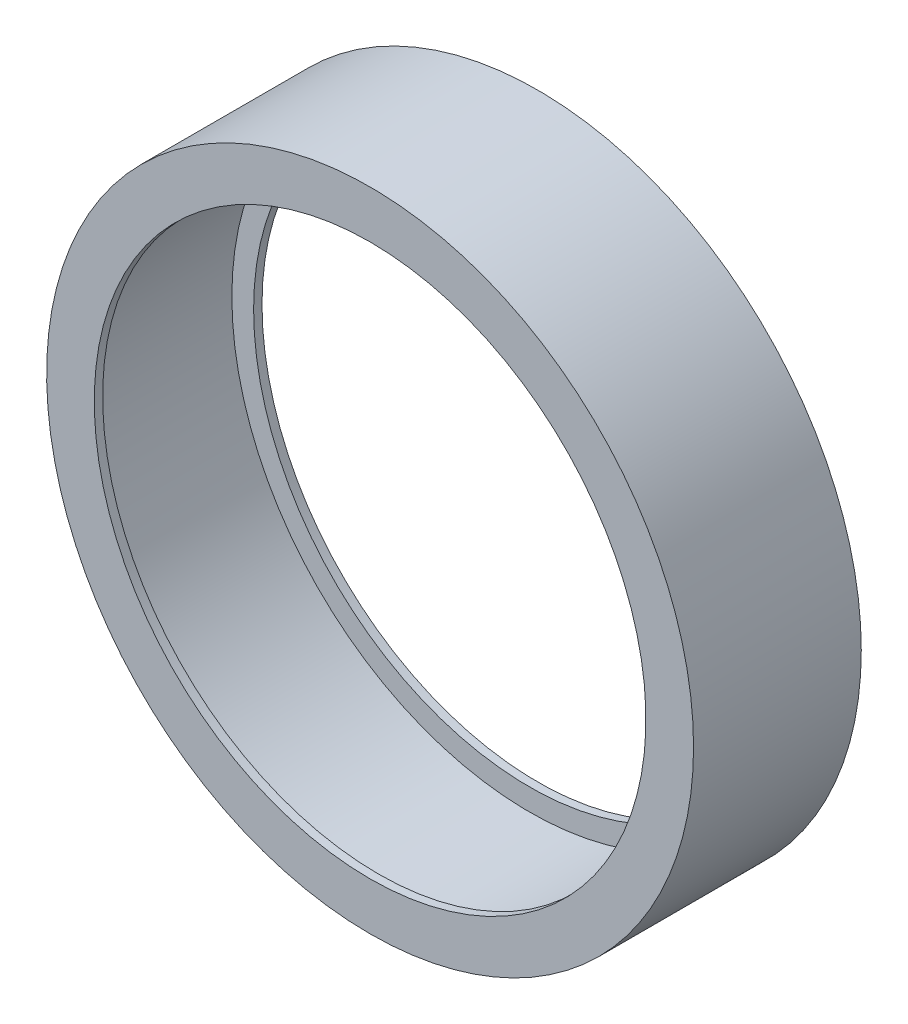
ISO-10303-21;
HEADER;
FILE_DESCRIPTION(('STEP AP214'),'2;1');
FILE_NAME('part.step','',(''),(''),'','','');
FILE_SCHEMA(('AUTOMOTIVE_DESIGN { 1 0 10303 214 1 1 1 1 }'));
ENDSEC;
DATA;
#1=APPLICATION_CONTEXT('core data for automotive mechanical design processes');
#2=APPLICATION_PROTOCOL_DEFINITION('international standard','automotive_design',2000,#1);
#3=PRODUCT_CONTEXT('',#1,'mechanical');
#4=PRODUCT('Part','Part','',(#3));
#5=PRODUCT_RELATED_PRODUCT_CATEGORY('part','',(#4));
#6=PRODUCT_DEFINITION_FORMATION('','',#4);
#7=PRODUCT_DEFINITION_CONTEXT('part definition',#1,'design');
#8=PRODUCT_DEFINITION('design','',#6,#7);
#9=PRODUCT_DEFINITION_SHAPE('','',#8);
#10=(LENGTH_UNIT() NAMED_UNIT(*) SI_UNIT(.MILLI.,.METRE.));
#11=(NAMED_UNIT(*) PLANE_ANGLE_UNIT() SI_UNIT($,.RADIAN.));
#12=(NAMED_UNIT(*) SI_UNIT($,.STERADIAN.) SOLID_ANGLE_UNIT());
#13=UNCERTAINTY_MEASURE_WITH_UNIT(LENGTH_MEASURE(1.E-05),#10,'distance_accuracy_value','');
#14=(GEOMETRIC_REPRESENTATION_CONTEXT(3) GLOBAL_UNCERTAINTY_ASSIGNED_CONTEXT((#13)) GLOBAL_UNIT_ASSIGNED_CONTEXT((#10,
#11,#12)) REPRESENTATION_CONTEXT('',''));
#15=CARTESIAN_POINT('',(0.,0.,0.));
#16=DIRECTION('',(0.,0.,1.));
#17=DIRECTION('',(1.,0.,0.));
#18=AXIS2_PLACEMENT_3D('',#15,#16,#17);
#19=CARTESIAN_POINT('',(0.,0.,85.));
#20=DIRECTION('',(0.,0.,-1.));
#21=DIRECTION('',(0.,1.,0.));
#22=AXIS2_PLACEMENT_3D('',#19,#20,#21);
#23=CYLINDRICAL_SURFACE('',#22,124.2);
#24=CARTESIAN_POINT('',(0.,0.,18.5));
#25=DIRECTION('',(0.,0.,-1.));
#26=DIRECTION('',(-1.,0.,0.));
#27=AXIS2_PLACEMENT_3D('',#24,#25,#26);
#28=CIRCLE('',#27,124.2);
#29=CARTESIAN_POINT('',(-124.2,0.,18.5));
#30=VERTEX_POINT('',#29);
#31=EDGE_CURVE('E51',#30,#30,#28,.T.);
#32=ORIENTED_EDGE('',*,*,#31,.T.);
#33=EDGE_LOOP('',(#32));
#34=FACE_BOUND('',#33,.T.);
#35=CARTESIAN_POINT('',(0.,0.,81.5));
#36=DIRECTION('',(0.,0.,1.));
#37=DIRECTION('',(0.,-1.,0.));
#38=AXIS2_PLACEMENT_3D('',#35,#36,#37);
#39=CIRCLE('',#38,124.2);
#40=CARTESIAN_POINT('',(0.,-124.2,81.5));
#41=VERTEX_POINT('',#40);
#42=EDGE_CURVE('E61',#41,#41,#39,.T.);
#43=ORIENTED_EDGE('',*,*,#42,.T.);
#44=EDGE_LOOP('',(#43));
#45=FACE_BOUND('',#44,.T.);
#46=ADVANCED_FACE('F36',(#34,#45),#23,.F.);
#47=CARTESIAN_POINT('',(0.,0.,85.));
#48=DIRECTION('',(0.,0.,1.));
#49=DIRECTION('',(1.,0.,0.));
#50=AXIS2_PLACEMENT_3D('',#47,#48,#49);
#51=PLANE('',#50);
#52=CARTESIAN_POINT('',(0.,0.,85.));
#53=DIRECTION('',(0.,0.,1.));
#54=DIRECTION('',(0.,-1.,0.));
#55=AXIS2_PLACEMENT_3D('',#52,#53,#54);
#56=CIRCLE('',#55,135.);
#57=CARTESIAN_POINT('',(0.,-135.,85.));
#58=VERTEX_POINT('',#57);
#59=EDGE_CURVE('E10',#58,#58,#56,.T.);
#60=ORIENTED_EDGE('',*,*,#59,.T.);
#61=EDGE_LOOP('',(#60));
#62=FACE_BOUND('',#61,.T.);
#63=CARTESIAN_POINT('',(0.,0.,85.));
#64=DIRECTION('',(0.,0.,1.));
#65=DIRECTION('',(0.,-1.,0.));
#66=AXIS2_PLACEMENT_3D('',#63,#64,#65);
#67=CIRCLE('',#66,115.118630452663);
#68=CARTESIAN_POINT('',(0.,-115.118630452663,85.));
#69=VERTEX_POINT('',#68);
#70=EDGE_CURVE('E54',#69,#69,#67,.T.);
#71=ORIENTED_EDGE('',*,*,#70,.F.);
#72=EDGE_LOOP('',(#71));
#73=FACE_BOUND('',#72,.T.);
#74=ADVANCED_FACE('F100',(#62,#73),#51,.T.);
#75=CARTESIAN_POINT('',(0.,0.,15.));
#76=DIRECTION('',(0.,0.,1.));
#77=DIRECTION('',(1.,0.,0.));
#78=AXIS2_PLACEMENT_3D('',#75,#76,#77);
#79=PLANE('',#78);
#80=CARTESIAN_POINT('',(0.,0.,15.));
#81=DIRECTION('',(0.,0.,1.));
#82=DIRECTION('',(1.,0.,0.));
#83=AXIS2_PLACEMENT_3D('',#80,#81,#82);
#84=CIRCLE('',#83,135.);
#85=CARTESIAN_POINT('',(135.,0.,15.));
#86=VERTEX_POINT('',#85);
#87=EDGE_CURVE('E45',#86,#86,#84,.T.);
#88=ORIENTED_EDGE('',*,*,#87,.F.);
#89=EDGE_LOOP('',(#88));
#90=FACE_BOUND('',#89,.T.);
#91=CARTESIAN_POINT('',(0.,0.,15.));
#92=DIRECTION('',(0.,0.,-1.));
#93=DIRECTION('',(-1.,0.,0.));
#94=AXIS2_PLACEMENT_3D('',#91,#92,#93);
#95=CIRCLE('',#94,115.118630452663);
#96=CARTESIAN_POINT('',(-115.118630452663,0.,15.));
#97=VERTEX_POINT('',#96);
#98=EDGE_CURVE('E66',#97,#97,#95,.T.);
#99=ORIENTED_EDGE('',*,*,#98,.F.);
#100=EDGE_LOOP('',(#99));
#101=FACE_BOUND('',#100,.T.);
#102=ADVANCED_FACE('F96',(#90,#101),#79,.F.);
#103=CARTESIAN_POINT('',(0.,0.,85.));
#104=DIRECTION('',(0.,0.,-1.));
#105=DIRECTION('',(0.,1.,0.));
#106=AXIS2_PLACEMENT_3D('',#103,#104,#105);
#107=CYLINDRICAL_SURFACE('',#106,135.);
#108=ORIENTED_EDGE('',*,*,#59,.F.);
#109=EDGE_LOOP('',(#108));
#110=FACE_BOUND('',#109,.T.);
#111=ORIENTED_EDGE('',*,*,#87,.T.);
#112=EDGE_LOOP('',(#111));
#113=FACE_BOUND('',#112,.T.);
#114=ADVANCED_FACE('F87',(#110,#113),#107,.T.);
#115=CARTESIAN_POINT('',(0.,0.,18.5));
#116=DIRECTION('',(0.,0.,-1.));
#117=DIRECTION('',(-1.,0.,0.));
#118=AXIS2_PLACEMENT_3D('',#115,#116,#117);
#119=PLANE('',#118);
#120=CARTESIAN_POINT('',(0.,0.,18.5));
#121=DIRECTION('',(0.,0.,-1.));
#122=DIRECTION('',(-1.,0.,0.));
#123=AXIS2_PLACEMENT_3D('',#120,#121,#122);
#124=CIRCLE('',#123,115.118630452663);
#125=CARTESIAN_POINT('',(-115.118630452663,0.,18.5));
#126=VERTEX_POINT('',#125);
#127=EDGE_CURVE('E72',#126,#126,#124,.T.);
#128=ORIENTED_EDGE('',*,*,#127,.T.);
#129=EDGE_LOOP('',(#128));
#130=FACE_BOUND('',#129,.T.);
#131=ORIENTED_EDGE('',*,*,#31,.F.);
#132=EDGE_LOOP('',(#131));
#133=FACE_BOUND('',#132,.T.);
#134=ADVANCED_FACE('F84',(#130,#133),#119,.F.);
#135=CARTESIAN_POINT('',(0.,0.,18.5));
#136=DIRECTION('',(0.,0.,-1.));
#137=DIRECTION('',(-1.,0.,0.));
#138=AXIS2_PLACEMENT_3D('',#135,#136,#137);
#139=CYLINDRICAL_SURFACE('',#138,115.118630452663);
#140=ORIENTED_EDGE('',*,*,#127,.F.);
#141=EDGE_LOOP('',(#140));
#142=FACE_BOUND('',#141,.T.);
#143=ORIENTED_EDGE('',*,*,#98,.T.);
#144=EDGE_LOOP('',(#143));
#145=FACE_BOUND('',#144,.T.);
#146=ADVANCED_FACE('F86',(#142,#145),#139,.F.);
#147=CARTESIAN_POINT('',(0.,0.,81.5));
#148=DIRECTION('',(0.,0.,1.));
#149=DIRECTION('',(1.,0.,0.));
#150=AXIS2_PLACEMENT_3D('',#147,#148,#149);
#151=PLANE('',#150);
#152=CARTESIAN_POINT('',(0.,0.,81.5));
#153=DIRECTION('',(0.,0.,1.));
#154=DIRECTION('',(0.,-1.,0.));
#155=AXIS2_PLACEMENT_3D('',#152,#153,#154);
#156=CIRCLE('',#155,115.118630452663);
#157=CARTESIAN_POINT('',(0.,-115.118630452663,81.5));
#158=VERTEX_POINT('',#157);
#159=EDGE_CURVE('E40',#158,#158,#156,.T.);
#160=ORIENTED_EDGE('',*,*,#159,.T.);
#161=EDGE_LOOP('',(#160));
#162=FACE_BOUND('',#161,.T.);
#163=ORIENTED_EDGE('',*,*,#42,.F.);
#164=EDGE_LOOP('',(#163));
#165=FACE_BOUND('',#164,.T.);
#166=ADVANCED_FACE('F93',(#162,#165),#151,.F.);
#167=CARTESIAN_POINT('',(0.,0.,81.5));
#168=DIRECTION('',(0.,0.,1.));
#169=DIRECTION('',(0.,-1.,0.));
#170=AXIS2_PLACEMENT_3D('',#167,#168,#169);
#171=CYLINDRICAL_SURFACE('',#170,115.118630452663);
#172=ORIENTED_EDGE('',*,*,#159,.F.);
#173=EDGE_LOOP('',(#172));
#174=FACE_BOUND('',#173,.T.);
#175=ORIENTED_EDGE('',*,*,#70,.T.);
#176=EDGE_LOOP('',(#175));
#177=FACE_BOUND('',#176,.T.);
#178=ADVANCED_FACE('F38',(#174,#177),#171,.F.);
#179=CLOSED_SHELL('',(#46,#74,#102,#114,#134,#146,#166,#178));
#180=MANIFOLD_SOLID_BREP('B2',#179);
#181=ADVANCED_BREP_SHAPE_REPRESENTATION('',(#18,#180),#14);
#182=SHAPE_DEFINITION_REPRESENTATION(#9,#181);
ENDSEC;
END-ISO-10303-21;
